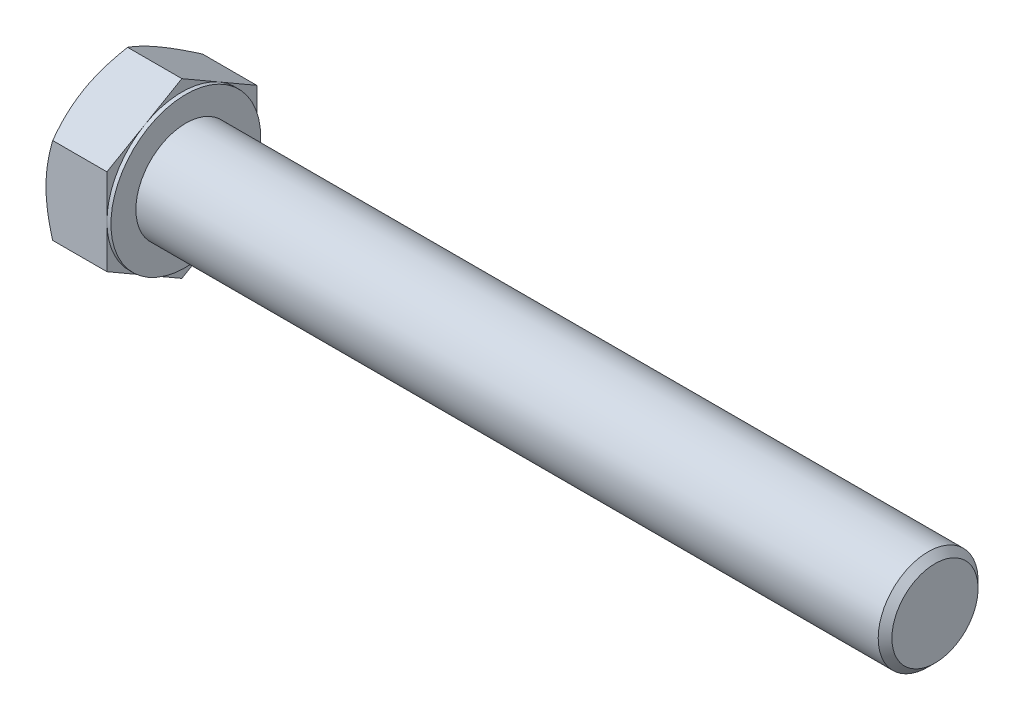
ISO-10303-21;
HEADER;
FILE_DESCRIPTION(('STEP AP214'),'2;1');
FILE_NAME('part.step','',(''),(''),'','','');
FILE_SCHEMA(('AUTOMOTIVE_DESIGN { 1 0 10303 214 1 1 1 1 }'));
ENDSEC;
DATA;
#1=APPLICATION_CONTEXT('core data for automotive mechanical design processes');
#2=APPLICATION_PROTOCOL_DEFINITION('international standard','automotive_design',2000,#1);
#3=PRODUCT_CONTEXT('',#1,'mechanical');
#4=PRODUCT('Part','Part','',(#3));
#5=PRODUCT_RELATED_PRODUCT_CATEGORY('part','',(#4));
#6=PRODUCT_DEFINITION_FORMATION('','',#4);
#7=PRODUCT_DEFINITION_CONTEXT('part definition',#1,'design');
#8=PRODUCT_DEFINITION('design','',#6,#7);
#9=PRODUCT_DEFINITION_SHAPE('','',#8);
#10=(LENGTH_UNIT() NAMED_UNIT(*) SI_UNIT(.MILLI.,.METRE.));
#11=(NAMED_UNIT(*) PLANE_ANGLE_UNIT() SI_UNIT($,.RADIAN.));
#12=(NAMED_UNIT(*) SI_UNIT($,.STERADIAN.) SOLID_ANGLE_UNIT());
#13=UNCERTAINTY_MEASURE_WITH_UNIT(LENGTH_MEASURE(1.E-05),#10,'distance_accuracy_value','');
#14=(GEOMETRIC_REPRESENTATION_CONTEXT(3) GLOBAL_UNCERTAINTY_ASSIGNED_CONTEXT((#13)) GLOBAL_UNIT_ASSIGNED_CONTEXT((#10,
#11,#12)) REPRESENTATION_CONTEXT('',''));
#15=CARTESIAN_POINT('',(0.,0.,0.));
#16=DIRECTION('',(0.,0.,1.));
#17=DIRECTION('',(1.,0.,0.));
#18=AXIS2_PLACEMENT_3D('',#15,#16,#17);
#19=CARTESIAN_POINT('',(13.,17.3205080756888,0.));
#20=DIRECTION('',(1.,0.,0.));
#21=DIRECTION('',(0.,0.,-1.));
#22=AXIS2_PLACEMENT_3D('',#19,#20,#21);
#23=PLANE('',#22);
#24=CARTESIAN_POINT('',(13.,0.,0.));
#25=DIRECTION('',(1.,0.,0.));
#26=DIRECTION('',(0.,0.,-1.));
#27=AXIS2_PLACEMENT_3D('',#24,#25,#26);
#28=CIRCLE('',#27,10.);
#29=CARTESIAN_POINT('',(13.,0.,-10.));
#30=VERTEX_POINT('',#29);
#31=EDGE_CURVE('E268',#30,#30,#28,.F.);
#32=ORIENTED_EDGE('',*,*,#31,.T.);
#33=EDGE_LOOP('',(#32));
#34=FACE_BOUND('',#33,.T.);
#35=CARTESIAN_POINT('',(13.,0.,0.));
#36=DIRECTION('',(1.,0.,0.));
#37=DIRECTION('',(0.,0.,-1.));
#38=AXIS2_PLACEMENT_3D('',#35,#36,#37);
#39=CIRCLE('',#38,15.);
#40=CARTESIAN_POINT('',(13.,0.,-15.));
#41=VERTEX_POINT('',#40);
#42=EDGE_CURVE('E326',#41,#41,#39,.T.);
#43=ORIENTED_EDGE('',*,*,#42,.T.);
#44=EDGE_LOOP('',(#43));
#45=FACE_BOUND('',#44,.T.);
#46=ADVANCED_FACE('F32',(#34,#45),#23,.T.);
#47=CARTESIAN_POINT('',(0.,0.,0.));
#48=DIRECTION('',(-1.,0.,0.));
#49=DIRECTION('',(0.,0.,1.));
#50=AXIS2_PLACEMENT_3D('',#47,#48,#49);
#51=CYLINDRICAL_SURFACE('',#50,10.);
#52=ORIENTED_EDGE('',*,*,#31,.F.);
#53=EDGE_LOOP('',(#52));
#54=FACE_BOUND('',#53,.T.);
#55=CARTESIAN_POINT('',(161.626,0.,0.));
#56=DIRECTION('',(-1.,0.,0.));
#57=DIRECTION('',(0.,0.,1.));
#58=AXIS2_PLACEMENT_3D('',#55,#56,#57);
#59=CIRCLE('',#58,10.);
#60=CARTESIAN_POINT('',(161.626,0.,10.));
#61=VERTEX_POINT('',#60);
#62=EDGE_CURVE('E266',#61,#61,#59,.T.);
#63=ORIENTED_EDGE('',*,*,#62,.T.);
#64=EDGE_LOOP('',(#63));
#65=FACE_BOUND('',#64,.T.);
#66=ADVANCED_FACE('F241',(#54,#65),#51,.T.);
#67=CARTESIAN_POINT('',(163.,0.,0.));
#68=DIRECTION('',(-1.,0.,0.));
#69=DIRECTION('',(0.,0.,1.));
#70=AXIS2_PLACEMENT_3D('',#67,#68,#69);
#71=CONICAL_SURFACE('',#70,8.626,0.785398163397452);
#72=ORIENTED_EDGE('',*,*,#62,.F.);
#73=EDGE_LOOP('',(#72));
#74=FACE_BOUND('',#73,.T.);
#75=CARTESIAN_POINT('',(163.,0.,0.));
#76=DIRECTION('',(-1.,0.,0.));
#77=DIRECTION('',(0.,0.,1.));
#78=AXIS2_PLACEMENT_3D('',#75,#76,#77);
#79=CIRCLE('',#78,8.626);
#80=CARTESIAN_POINT('',(163.,0.,8.626));
#81=VERTEX_POINT('',#80);
#82=EDGE_CURVE('E228',#81,#81,#79,.T.);
#83=ORIENTED_EDGE('',*,*,#82,.T.);
#84=EDGE_LOOP('',(#83));
#85=FACE_BOUND('',#84,.T.);
#86=ADVANCED_FACE('F246',(#74,#85),#71,.T.);
#87=CARTESIAN_POINT('',(163.,0.,0.));
#88=DIRECTION('',(-1.,0.,0.));
#89=DIRECTION('',(0.,0.,1.));
#90=AXIS2_PLACEMENT_3D('',#87,#88,#89);
#91=PLANE('',#90);
#92=ORIENTED_EDGE('',*,*,#82,.F.);
#93=EDGE_LOOP('',(#92));
#94=FACE_BOUND('',#93,.T.);
#95=ADVANCED_FACE('F253',(#94),#91,.F.);
#96=CARTESIAN_POINT('',(12.2,15.,0.));
#97=DIRECTION('',(1.,0.,0.));
#98=DIRECTION('',(0.,0.,-1.));
#99=AXIS2_PLACEMENT_3D('',#96,#97,#98);
#100=PLANE('',#99);
#101=DIRECTION('',(0.,0.500000000000001,0.866025403784438));
#102=VECTOR('',#101,1.);
#103=CARTESIAN_POINT('',(12.2,8.66025403784438,-15.));
#104=LINE('',#103,#102);
#105=CARTESIAN_POINT('',(12.2,8.66025403784441,-15.));
#106=VERTEX_POINT('',#105);
#107=CARTESIAN_POINT('',(12.2,12.9903810567666,-7.50000000000002));
#108=VERTEX_POINT('',#107);
#109=EDGE_CURVE('E165',#106,#108,#104,.T.);
#110=ORIENTED_EDGE('',*,*,#109,.T.);
#111=CARTESIAN_POINT('',(12.2,0.,0.));
#112=DIRECTION('',(-1.,0.,0.));
#113=DIRECTION('',(0.,0.,1.));
#114=AXIS2_PLACEMENT_3D('',#111,#112,#113);
#115=CIRCLE('',#114,15.);
#116=CARTESIAN_POINT('',(12.2,0.,-15.));
#117=VERTEX_POINT('',#116);
#118=EDGE_CURVE('E48',#108,#117,#115,.T.);
#119=ORIENTED_EDGE('',*,*,#118,.T.);
#120=DIRECTION('',(0.,1.,0.));
#121=VECTOR('',#120,1.);
#122=CARTESIAN_POINT('',(12.2,8.66025403784438,-15.));
#123=LINE('',#122,#121);
#124=EDGE_CURVE('E37',#117,#106,#123,.T.);
#125=ORIENTED_EDGE('',*,*,#124,.T.);
#126=EDGE_LOOP('',(#110,#119,#125));
#127=FACE_BOUND('',#126,.T.);
#128=ADVANCED_FACE('F256',(#127),#100,.T.);
#129=CARTESIAN_POINT('',(12.2,17.3205080756888,0.));
#130=VERTEX_POINT('',#129);
#131=EDGE_CURVE('E163',#108,#130,#104,.T.);
#132=ORIENTED_EDGE('',*,*,#131,.T.);
#133=DIRECTION('',(0.,-0.500000000000001,0.866025403784438));
#134=VECTOR('',#133,1.);
#135=CARTESIAN_POINT('',(12.2,17.3205080756888,0.));
#136=LINE('',#135,#134);
#137=CARTESIAN_POINT('',(12.2,12.9903810567666,7.50000000000002));
#138=VERTEX_POINT('',#137);
#139=EDGE_CURVE('E162',#130,#138,#136,.T.);
#140=ORIENTED_EDGE('',*,*,#139,.T.);
#141=EDGE_CURVE('E151',#138,#108,#115,.T.);
#142=ORIENTED_EDGE('',*,*,#141,.T.);
#143=EDGE_LOOP('',(#132,#140,#142));
#144=FACE_BOUND('',#143,.T.);
#145=ADVANCED_FACE('F261',(#144),#100,.T.);
#146=CARTESIAN_POINT('',(12.2,8.66025403784441,15.));
#147=VERTEX_POINT('',#146);
#148=EDGE_CURVE('E130',#138,#147,#136,.T.);
#149=ORIENTED_EDGE('',*,*,#148,.T.);
#150=DIRECTION('',(0.,-1.,0.));
#151=VECTOR('',#150,1.);
#152=CARTESIAN_POINT('',(12.2,8.66025403784437,15.));
#153=LINE('',#152,#151);
#154=CARTESIAN_POINT('',(12.2,0.,15.));
#155=VERTEX_POINT('',#154);
#156=EDGE_CURVE('E124',#147,#155,#153,.T.);
#157=ORIENTED_EDGE('',*,*,#156,.T.);
#158=EDGE_CURVE('E128',#155,#138,#115,.T.);
#159=ORIENTED_EDGE('',*,*,#158,.T.);
#160=EDGE_LOOP('',(#149,#157,#159));
#161=FACE_BOUND('',#160,.T.);
#162=ADVANCED_FACE('F126',(#161),#100,.T.);
#163=CARTESIAN_POINT('',(12.2,-8.6602540378444,15.));
#164=VERTEX_POINT('',#163);
#165=EDGE_CURVE('E134',#155,#164,#153,.T.);
#166=ORIENTED_EDGE('',*,*,#165,.T.);
#167=DIRECTION('',(0.,-0.500000000000001,-0.866025403784438));
#168=VECTOR('',#167,1.);
#169=CARTESIAN_POINT('',(12.2,-17.3205080756888,0.));
#170=LINE('',#169,#168);
#171=CARTESIAN_POINT('',(12.2,-12.9903810567666,7.50000000000002));
#172=VERTEX_POINT('',#171);
#173=EDGE_CURVE('E141',#164,#172,#170,.T.);
#174=ORIENTED_EDGE('',*,*,#173,.T.);
#175=EDGE_CURVE('E138',#172,#155,#115,.T.);
#176=ORIENTED_EDGE('',*,*,#175,.T.);
#177=EDGE_LOOP('',(#166,#174,#176));
#178=FACE_BOUND('',#177,.T.);
#179=ADVANCED_FACE('F139',(#178),#100,.T.);
#180=CARTESIAN_POINT('',(12.2,-17.3205080756888,0.));
#181=VERTEX_POINT('',#180);
#182=EDGE_CURVE('E157',#172,#181,#170,.T.);
#183=ORIENTED_EDGE('',*,*,#182,.T.);
#184=DIRECTION('',(0.,0.5,-0.866025403784438));
#185=VECTOR('',#184,1.);
#186=CARTESIAN_POINT('',(12.2,-8.66025403784441,-15.));
#187=LINE('',#186,#185);
#188=CARTESIAN_POINT('',(12.2,-12.9903810567666,-7.50000000000001));
#189=VERTEX_POINT('',#188);
#190=EDGE_CURVE('E339',#181,#189,#187,.T.);
#191=ORIENTED_EDGE('',*,*,#190,.T.);
#192=EDGE_CURVE('E145',#189,#172,#115,.T.);
#193=ORIENTED_EDGE('',*,*,#192,.T.);
#194=EDGE_LOOP('',(#183,#191,#193));
#195=FACE_BOUND('',#194,.T.);
#196=ADVANCED_FACE('F341',(#195),#100,.T.);
#197=CARTESIAN_POINT('',(12.2,-8.6602540378444,-15.));
#198=VERTEX_POINT('',#197);
#199=EDGE_CURVE('E152',#189,#198,#187,.T.);
#200=ORIENTED_EDGE('',*,*,#199,.T.);
#201=EDGE_CURVE('E11',#198,#117,#123,.T.);
#202=ORIENTED_EDGE('',*,*,#201,.T.);
#203=EDGE_CURVE('E338',#117,#189,#115,.T.);
#204=ORIENTED_EDGE('',*,*,#203,.T.);
#205=EDGE_LOOP('',(#200,#202,#204));
#206=FACE_BOUND('',#205,.T.);
#207=ADVANCED_FACE('F262',(#206),#100,.T.);
#208=CARTESIAN_POINT('',(0.,0.,0.));
#209=DIRECTION('',(-1.,0.,0.));
#210=DIRECTION('',(0.,0.,1.));
#211=AXIS2_PLACEMENT_3D('',#208,#209,#210);
#212=CYLINDRICAL_SURFACE('',#211,15.);
#213=ORIENTED_EDGE('',*,*,#118,.F.);
#214=ORIENTED_EDGE('',*,*,#141,.F.);
#215=ORIENTED_EDGE('',*,*,#158,.F.);
#216=ORIENTED_EDGE('',*,*,#175,.F.);
#217=ORIENTED_EDGE('',*,*,#192,.F.);
#218=ORIENTED_EDGE('',*,*,#203,.F.);
#219=EDGE_LOOP('',(#213,#214,#215,#216,#217,#218));
#220=FACE_BOUND('',#219,.T.);
#221=ORIENTED_EDGE('',*,*,#42,.F.);
#222=EDGE_LOOP('',(#221));
#223=FACE_BOUND('',#222,.T.);
#224=ADVANCED_FACE('F148',(#220,#223),#212,.T.);
#225=CARTESIAN_POINT('',(0.,17.3205080756888,0.));
#226=DIRECTION('',(1.,0.,0.));
#227=DIRECTION('',(0.,0.,-1.));
#228=AXIS2_PLACEMENT_3D('',#225,#226,#227);
#229=PLANE('',#228);
#230=CARTESIAN_POINT('',(0.,0.,0.));
#231=DIRECTION('',(1.,0.,0.));
#232=DIRECTION('',(0.,0.,-1.));
#233=AXIS2_PLACEMENT_3D('',#230,#231,#232);
#234=CIRCLE('',#233,15.);
#235=CARTESIAN_POINT('',(0.,0.,-15.));
#236=VERTEX_POINT('',#235);
#237=CARTESIAN_POINT('',(0.,12.9903810567666,-7.50000000000001));
#238=VERTEX_POINT('',#237);
#239=EDGE_CURVE('E325',#236,#238,#234,.T.);
#240=ORIENTED_EDGE('',*,*,#239,.F.);
#241=CARTESIAN_POINT('',(0.,-12.9903810567666,-7.50000000000002));
#242=VERTEX_POINT('',#241);
#243=EDGE_CURVE('E324',#242,#236,#234,.T.);
#244=ORIENTED_EDGE('',*,*,#243,.F.);
#245=CARTESIAN_POINT('',(0.,-12.9903810567666,7.50000000000003));
#246=VERTEX_POINT('',#245);
#247=EDGE_CURVE('E286',#246,#242,#234,.T.);
#248=ORIENTED_EDGE('',*,*,#247,.F.);
#249=CARTESIAN_POINT('',(0.,0.,15.));
#250=VERTEX_POINT('',#249);
#251=EDGE_CURVE('E296',#250,#246,#234,.T.);
#252=ORIENTED_EDGE('',*,*,#251,.F.);
#253=CARTESIAN_POINT('',(0.,12.9903810567666,7.50000000000002));
#254=VERTEX_POINT('',#253);
#255=EDGE_CURVE('E304',#254,#250,#234,.T.);
#256=ORIENTED_EDGE('',*,*,#255,.F.);
#257=EDGE_CURVE('E309',#238,#254,#234,.T.);
#258=ORIENTED_EDGE('',*,*,#257,.F.);
#259=EDGE_LOOP('',(#240,#244,#248,#252,#256,#258));
#260=FACE_BOUND('',#259,.T.);
#261=ADVANCED_FACE('F192',(#260),#229,.F.);
#262=CARTESIAN_POINT('',(-3.75000000000001,0.,0.));
#263=DIRECTION('',(1.,0.,0.));
#264=DIRECTION('',(0.,0.,-1.));
#265=AXIS2_PLACEMENT_3D('',#262,#263,#264);
#266=CONICAL_SURFACE('',#265,8.5048094716167,1.0471975511966);
#267=CARTESIAN_POINT('',(1.33981262948895,17.3206235457426,0.0002));
#268=CARTESIAN_POINT('',(1.22992178974395,17.130274565913,-0.329494104233799));
#269=CARTESIAN_POINT('',(1.12501758932862,16.939183122782,-0.6604741926283));
#270=CARTESIAN_POINT('',(0.926568581943114,16.5554679079492,-1.32508844035602));
#271=CARTESIAN_POINT('',(0.833027511049504,16.3628436543362,-1.6587234343838));
#272=CARTESIAN_POINT('',(0.65856214760987,15.9756905506624,-2.32929228025473));
#273=CARTESIAN_POINT('',(0.577667706602196,15.7811583127512,-2.66623200002701));
#274=CARTESIAN_POINT('',(0.430232643422051,15.3907420734253,-3.34245276263938));
#275=CARTESIAN_POINT('',(0.363691202381333,15.1948581497855,-3.68173367076952));
#276=CARTESIAN_POINT('',(0.247792374696314,14.8067578304067,-4.35394314236732));
#277=CARTESIAN_POINT('',(0.19805138343667,14.6145702475688,-4.68682180042634));
#278=CARTESIAN_POINT('',(0.11464674900361,14.2293144416655,-5.3541044301617));
#279=CARTESIAN_POINT('',(0.0809834152900895,14.0362462017216,-5.6885084310725));
#280=CARTESIAN_POINT('',(0.0305840757080862,13.6497853945792,-6.35787818417716));
#281=CARTESIAN_POINT('',(0.0138279549580509,13.4563934876199,-6.69284279280336));
#282=CARTESIAN_POINT('',(-0.00239660617302255,13.0694311550724,-7.36308121339101));
#283=CARTESIAN_POINT('',(-0.00186558072757971,12.8758607351851,-7.69835501547825));
#284=CARTESIAN_POINT('',(0.0152766129981678,12.5139822792559,-8.32514688731221));
#285=CARTESIAN_POINT('',(0.0297968460490141,12.3456484541475,-8.61670962503243));
#286=CARTESIAN_POINT('',(0.071637140422411,12.0093680110861,-9.19916443800649));
#287=CARTESIAN_POINT('',(0.0989581071094762,11.8414214213658,-9.49005646435989));
#288=CARTESIAN_POINT('',(0.165923511998905,11.5060066717823,-10.0710118522466));
#289=CARTESIAN_POINT('',(0.205578128270663,11.338539022767,-10.3610743289652));
#290=CARTESIAN_POINT('',(0.296515103017905,11.0043888432043,-10.939839417326));
#291=CARTESIAN_POINT('',(0.34779825196926,10.8377063668174,-11.2285419351595));
#292=CARTESIAN_POINT('',(0.52038686474711,10.3317324659531,-12.1049144387604));
#293=CARTESIAN_POINT('',(0.658901178256933,9.99390625559024,-12.6900465992373));
#294=CARTESIAN_POINT('',(0.973271968475216,9.32329122184509,-13.8515859100034));
#295=CARTESIAN_POINT('',(1.14905461461788,8.99049381241394,-14.4280079317654));
#296=CARTESIAN_POINT('',(1.33981262948894,8.66013856779054,-15.0002));
#297=B_SPLINE_CURVE_WITH_KNOTS('',3,(#267,#268,#269,#270,#271,#272,#273,#274,#275,#276,#277,
#278,#279,#280,#281,#282,#283,#284,#285,#286,#287,#288,#289,#290,#291,#292,#293,#294,#295,#296),
.UNSPECIFIED.,.F.,.F.,(4,2,2,2,2,2,2,2,2,2,2,2,2,2,4),(0.,1.18875411504163,2.37789802800057,
3.56980778300395,4.76164951910136,5.92407379683759,7.08652044780812,8.24758247406079,
9.40860862348377,10.4193068498566,11.4300765712312,12.4416826308653,13.4533574773408,
15.5211962051185,17.5849760846241),.UNSPECIFIED.);
#298=CARTESIAN_POINT('',(1.33974596215562,17.3205080756888,0.));
#299=VERTEX_POINT('',#298);
#300=EDGE_CURVE('E56',#299,#238,#297,.T.);
#301=ORIENTED_EDGE('',*,*,#300,.T.);
#302=ORIENTED_EDGE('',*,*,#257,.T.);
#303=CARTESIAN_POINT('',(1.33981262948894,8.66013856779053,15.0002));
#304=CARTESIAN_POINT('',(1.22992178974394,8.85048754762015,14.6705058957662));
#305=CARTESIAN_POINT('',(1.12501758932861,9.04157899075112,14.3395258073717));
#306=CARTESIAN_POINT('',(0.926568581943103,9.42529420558398,13.674911559644));
#307=CARTESIAN_POINT('',(0.833027511049493,9.617918459197,13.3412765656162));
#308=CARTESIAN_POINT('',(0.658562147609861,10.0050715628708,12.6707077197453));
#309=CARTESIAN_POINT('',(0.57766770660219,10.199603800782,12.333767999973));
#310=CARTESIAN_POINT('',(0.430232643422045,10.5900200401078,11.6575472373606));
#311=CARTESIAN_POINT('',(0.363691202381327,10.7859039637477,11.3182663292305));
#312=CARTESIAN_POINT('',(0.247792374696308,11.1740042831265,10.6460568576327));
#313=CARTESIAN_POINT('',(0.198051383436665,11.3661918659643,10.3131781995737));
#314=CARTESIAN_POINT('',(0.114646749003607,11.7514476718676,9.6458955698383));
#315=CARTESIAN_POINT('',(0.080983415290087,11.9445159118115,9.31149156892751));
#316=CARTESIAN_POINT('',(0.0305840757080849,12.3309767189539,8.64212181582285));
#317=CARTESIAN_POINT('',(0.0138279549580503,12.5243686259132,8.30715720719665));
#318=CARTESIAN_POINT('',(-0.0023966061730225,12.9113309584608,7.636918786609));
#319=CARTESIAN_POINT('',(-0.00186558072757983,13.1049013783481,7.30164498452176));
#320=CARTESIAN_POINT('',(0.0152766129981677,13.4667798342773,6.6748531126878));
#321=CARTESIAN_POINT('',(0.0297968460490142,13.6351136593857,6.38329037496757));
#322=CARTESIAN_POINT('',(0.0716371404224116,13.9713941024471,5.80083556199352));
#323=CARTESIAN_POINT('',(0.0989581071094771,14.1393406921673,5.50994353564011));
#324=CARTESIAN_POINT('',(0.165923511998907,14.4747554417509,4.92898814775338));
#325=CARTESIAN_POINT('',(0.205578128270665,14.6422230907662,4.63892567103482));
#326=CARTESIAN_POINT('',(0.296515103017909,14.9763732703289,4.06016058267396));
#327=CARTESIAN_POINT('',(0.347798251969264,15.1430557467157,3.77145806484047));
#328=CARTESIAN_POINT('',(0.520386864747114,15.6490296475801,2.89508556123959));
#329=CARTESIAN_POINT('',(0.658901178256938,15.9868558579429,2.30995340076275));
#330=CARTESIAN_POINT('',(0.973271968475223,16.6574708916881,1.14841408999664));
#331=CARTESIAN_POINT('',(1.14905461461789,16.9902683011192,0.571992068234584));
#332=CARTESIAN_POINT('',(1.33981262948895,17.3206235457426,-0.000200000000001569));
#333=B_SPLINE_CURVE_WITH_KNOTS('',3,(#303,#304,#305,#306,#307,#308,#309,#310,#311,#312,#313,
#314,#315,#316,#317,#318,#319,#320,#321,#322,#323,#324,#325,#326,#327,#328,#329,#330,#331,#332),
.UNSPECIFIED.,.F.,.F.,(4,2,2,2,2,2,2,2,2,2,2,2,2,2,4),(0.,1.18875411504163,2.37789802800057,
3.56980778300395,4.76164951910136,5.92407379683759,7.08652044780812,8.24758247406078,
9.40860862348377,10.4193068498566,11.4300765712312,12.4416826308653,13.4533574773408,
15.5211962051185,17.5849760846241),.UNSPECIFIED.);
#334=EDGE_CURVE('E227',#254,#299,#333,.T.);
#335=ORIENTED_EDGE('',*,*,#334,.T.);
#336=EDGE_LOOP('',(#301,#302,#335));
#337=FACE_BOUND('',#336,.T.);
#338=ADVANCED_FACE('F181',(#337),#266,.T.);
#339=CARTESIAN_POINT('',(1.33974596215561,8.66025403784437,15.));
#340=VERTEX_POINT('',#339);
#341=EDGE_CURVE('E222',#340,#254,#333,.T.);
#342=ORIENTED_EDGE('',*,*,#341,.T.);
#343=ORIENTED_EDGE('',*,*,#255,.T.);
#344=CARTESIAN_POINT('',(7.34067071515341,-23.3042652502346,15.));
#345=CARTESIAN_POINT('',(7.18156779867751,-22.9765341561843,15.));
#346=CARTESIAN_POINT('',(7.02325509780218,-22.648419619423,15.));
#347=CARTESIAN_POINT('',(6.70838900944477,-21.9913436592706,15.));
#348=CARTESIAN_POINT('',(6.55183563953033,-21.6623822274633,15.));
#349=CARTESIAN_POINT('',(6.08504186446723,-20.6740205756075,15.));
#350=CARTESIAN_POINT('',(5.77771466676501,-20.013239287009,15.));
#351=CARTESIAN_POINT('',(5.1710334736663,-18.6836927165475,15.));
#352=CARTESIAN_POINT('',(4.87173163285706,-18.0149035792745,15.));
#353=CARTESIAN_POINT('',(4.28531537205743,-16.672021466831,15.));
#354=CARTESIAN_POINT('',(3.99820037915414,-15.9979287427559,15.));
#355=CARTESIAN_POINT('',(3.43032614621723,-14.6214178954332,15.));
#356=CARTESIAN_POINT('',(3.15007396164639,-13.9187894970855,15.));
#357=CARTESIAN_POINT('',(2.61067811288133,-12.5053227943984,15.));
#358=CARTESIAN_POINT('',(2.35153681205784,-11.7944835809986,15.));
#359=CARTESIAN_POINT('',(1.86113921287668,-10.3648046207861,15.));
#360=CARTESIAN_POINT('',(1.62982681897162,-9.64598427064374,15.));
#361=CARTESIAN_POINT('',(1.20246884447069,-8.19796416946781,15.));
#362=CARTESIAN_POINT('',(1.00641219949375,-7.4687677525739,15.));
#363=CARTESIAN_POINT('',(0.746381489548805,-6.36908708426342,15.));
#364=CARTESIAN_POINT('',(0.665556542332847,-6.00256349464106,15.));
#365=CARTESIAN_POINT('',(0.516215906279777,-5.26700410132772,15.));
#366=CARTESIAN_POINT('',(0.447699966240371,-4.89796834906453,15.));
#367=CARTESIAN_POINT('',(0.324184020148005,-4.1576349881433,15.));
#368=CARTESIAN_POINT('',(0.269183850795452,-3.78633740686858,15.));
#369=CARTESIAN_POINT('',(0.173795520486809,-3.04187310827177,15.));
#370=CARTESIAN_POINT('',(0.133406727499752,-2.66870647250577,15.));
#371=CARTESIAN_POINT('',(0.0685517789539601,-1.92591313748794,15.));
#372=CARTESIAN_POINT('',(0.0438838189783439,-1.55630416674746,15.));
#373=CARTESIAN_POINT('',(0.010202640260208,-0.816374859116392,15.));
#374=CARTESIAN_POINT('',(0.00118916075528576,-0.446054534177949,15.));
#375=CARTESIAN_POINT('',(-0.000968542023530779,0.294636183080746,15.));
#376=CARTESIAN_POINT('',(0.00588729773335592,0.665006575594019,15.));
#377=CARTESIAN_POINT('',(0.0353005369749854,1.40512739642794,15.));
#378=CARTESIAN_POINT('',(0.0578586405592725,1.7748777962024,15.));
#379=CARTESIAN_POINT('',(0.130359529520864,2.66225131615495,15.));
#380=CARTESIAN_POINT('',(0.187682894452926,3.17928211157757,15.));
#381=CARTESIAN_POINT('',(0.329920354848765,4.20953694220726,15.));
#382=CARTESIAN_POINT('',(0.414838167720419,4.72276045497981,15.));
#383=CARTESIAN_POINT('',(0.609243756551085,5.74490151650211,15.));
#384=CARTESIAN_POINT('',(0.718750596562519,6.25381540456157,15.));
#385=CARTESIAN_POINT('',(0.958990010594623,7.26655289822442,15.));
#386=CARTESIAN_POINT('',(1.08972227136761,7.77037657883325,15.));
#387=CARTESIAN_POINT('',(1.37231868690396,8.78401362845183,15.));
#388=CARTESIAN_POINT('',(1.52458533942789,9.29371400216389,15.));
#389=CARTESIAN_POINT('',(1.84492743287877,10.3080942836652,15.));
#390=CARTESIAN_POINT('',(2.01300297781563,10.8127741583994,15.));
#391=CARTESIAN_POINT('',(2.36228753701366,11.8173612741182,15.));
#392=CARTESIAN_POINT('',(2.54349222713181,12.3172700256552,15.));
#393=CARTESIAN_POINT('',(2.91689581252832,13.3129403414727,15.));
#394=CARTESIAN_POINT('',(3.10909458126464,13.8087019534116,15.));
#395=CARTESIAN_POINT('',(3.57360485355451,14.9746038035994,15.));
#396=CARTESIAN_POINT('',(3.84982124497854,15.6431858961614,15.));
#397=CARTESIAN_POINT('',(4.41563784259355,16.9746795615836,15.));
#398=CARTESIAN_POINT('',(4.70523886905364,17.6375907839498,15.));
#399=CARTESIAN_POINT('',(5.29515643160973,18.9587926969959,15.));
#400=CARTESIAN_POINT('',(5.59547534200812,19.6170823247284,15.));
#401=CARTESIAN_POINT('',(6.20467573064066,20.929660672768,15.));
#402=CARTESIAN_POINT('',(6.51355702718966,21.5839494776095,15.));
#403=CARTESIAN_POINT('',(7.13862847265524,22.8898994902308,15.));
#404=CARTESIAN_POINT('',(7.45482623896846,23.5415570457316,15.));
#405=CARTESIAN_POINT('',(8.09295875416606,24.8420565829958,15.));
#406=CARTESIAN_POINT('',(8.4148935275708,25.4908985527104,15.));
#407=CARTESIAN_POINT('',(9.06347819779508,26.7861146196969,15.));
#408=CARTESIAN_POINT('',(9.39012748233845,27.4324890238882,15.));
#409=CARTESIAN_POINT('',(10.0474129227362,28.723208677604,15.));
#410=CARTESIAN_POINT('',(10.3780490943186,29.367553919111,15.));
#411=CARTESIAN_POINT('',(11.3194716957165,31.1905009177914,15.));
#412=CARTESIAN_POINT('',(11.9342118225534,32.3670608397852,15.));
#413=CARTESIAN_POINT('',(13.1721121262381,34.7157851558138,15.));
#414=CARTESIAN_POINT('',(13.7952725995008,35.8879493932455,15.));
#415=CARTESIAN_POINT('',(15.0464839728173,38.2259091871195,15.));
#416=CARTESIAN_POINT('',(15.6745188321177,39.3917133340376,15.));
#417=CARTESIAN_POINT('',(16.6203232909783,41.1383439953253,15.));
#418=CARTESIAN_POINT('',(16.9362082187349,41.7201925939891,15.));
#419=CARTESIAN_POINT('',(17.5691038731806,42.8832760591036,15.));
#420=CARTESIAN_POINT('',(17.886114598108,43.4645109265129,15.));
#421=CARTESIAN_POINT('',(18.2036234821095,44.045473617856,15.));
#422=B_SPLINE_CURVE_WITH_KNOTS('',3,(#344,#345,#346,#347,#348,#349,#350,#351,#352,#353,#354,
#355,#356,#357,#358,#359,#360,#361,#362,#363,#364,#365,#366,#367,#368,#369,#370,#371,#372,#373,
#374,#375,#376,#377,#378,#379,#380,#381,#382,#383,#384,#385,#386,#387,#388,#389,#390,#391,#392,
#393,#394,#395,#396,#397,#398,#399,#400,#401,#402,#403,#404,#405,#406,#407,#408,#409,#410,#411,
#412,#413,#414,#415,#416,#417,#418,#419,#420,#421),.UNSPECIFIED.,.F.,.F.,(4,2,2,2,2,2,2,2,2,2,2,
2,2,2,2,2,2,2,2,2,2,2,2,2,2,2,2,2,2,2,2,2,2,2,2,2,2,2,4),(0.,1.0929265174083,2.18586393846465,
4.37206003457367,6.57008822665549,8.76801297307203,11.037126459905,13.3064936266831,
15.5712068703933,17.8352081295547,18.9610232976558,20.0868154875035,21.2125940746902,
22.3383239592763,23.4492954988051,24.5602485322974,25.6712059783518,26.7822132436575,
28.3419475576269,29.9018920796078,31.4630502397376,33.024185362174,34.6197538618724,
36.2153328598743,37.8103887148469,39.4054262143923,41.5754079616112,43.7455228716224,
45.9161215420534,48.0866741897833,50.259598540134,52.4325321799329,54.6051861145462,
56.7778486229257,60.7602319673314,64.7427558676026,68.715363316539,70.7015596979606,
72.6877529724689),.UNSPECIFIED.);
#423=EDGE_CURVE('E221',#250,#340,#422,.T.);
#424=ORIENTED_EDGE('',*,*,#423,.T.);
#425=EDGE_LOOP('',(#342,#343,#424));
#426=FACE_BOUND('',#425,.T.);
#427=ADVANCED_FACE('F302',(#426),#266,.T.);
#428=CARTESIAN_POINT('',(1.33974596215562,-8.6602540378444,15.));
#429=VERTEX_POINT('',#428);
#430=EDGE_CURVE('E216',#429,#250,#422,.T.);
#431=ORIENTED_EDGE('',*,*,#430,.T.);
#432=ORIENTED_EDGE('',*,*,#251,.T.);
#433=CARTESIAN_POINT('',(1.33981262948897,-17.3206235457426,-0.000200000000000181));
#434=CARTESIAN_POINT('',(1.22992178974396,-17.130274565913,0.329494104233799));
#435=CARTESIAN_POINT('',(1.12501758932864,-16.9391831227821,0.6604741926283));
#436=CARTESIAN_POINT('',(0.926568581943126,-16.5554679079492,1.32508844035602));
#437=CARTESIAN_POINT('',(0.833027511049516,-16.3628436543362,1.6587234343838));
#438=CARTESIAN_POINT('',(0.658562147609881,-15.9756905506624,2.32929228025473));
#439=CARTESIAN_POINT('',(0.577667706602208,-15.7811583127512,2.66623200002701));
#440=CARTESIAN_POINT('',(0.430232643422063,-15.3907420734253,3.34245276263939));
#441=CARTESIAN_POINT('',(0.363691202381345,-15.1948581497855,3.68173367076952));
#442=CARTESIAN_POINT('',(0.247792374696326,-14.8067578304067,4.35394314236732));
#443=CARTESIAN_POINT('',(0.198051383436683,-14.6145702475688,4.68682180042635));
#444=CARTESIAN_POINT('',(0.114646749003623,-14.2293144416656,5.3541044301617));
#445=CARTESIAN_POINT('',(0.0809834152901017,-14.0362462017216,5.6885084310725));
#446=CARTESIAN_POINT('',(0.0305840757080979,-13.6497853945793,6.35787818417716));
#447=CARTESIAN_POINT('',(0.0138279549580624,-13.4563934876199,6.69284279280336));
#448=CARTESIAN_POINT('',(-0.00239660617301051,-13.0694311550724,7.36308121339102));
#449=CARTESIAN_POINT('',(-0.00186558072756715,-12.8758607351851,7.69835501547826));
#450=CARTESIAN_POINT('',(0.0152766129981798,-12.5139822792559,8.32514688731222));
#451=CARTESIAN_POINT('',(0.029796846049025,-12.3456484541475,8.61670962503244));
#452=CARTESIAN_POINT('',(0.0716371404224209,-12.0093680110861,9.19916443800649));
#453=CARTESIAN_POINT('',(0.098958107109486,-11.8414214213659,9.4900564643599));
#454=CARTESIAN_POINT('',(0.165923511998914,-11.5060066717823,10.0710118522466));
#455=CARTESIAN_POINT('',(0.205578128270672,-11.338539022767,10.3610743289652));
#456=CARTESIAN_POINT('',(0.296515103017914,-11.0043888432043,10.939839417326));
#457=CARTESIAN_POINT('',(0.347798251969268,-10.8377063668174,11.2285419351595));
#458=CARTESIAN_POINT('',(0.520386864747118,-10.3317324659531,12.1049144387604));
#459=CARTESIAN_POINT('',(0.658901178256941,-9.99390625559026,12.6900465992373));
#460=CARTESIAN_POINT('',(0.973271968475223,-9.32329122184512,13.8515859100034));
#461=CARTESIAN_POINT('',(1.14905461461789,-8.99049381241397,14.4280079317654));
#462=CARTESIAN_POINT('',(1.33981262948895,-8.66013856779056,15.0002));
#463=B_SPLINE_CURVE_WITH_KNOTS('',3,(#433,#434,#435,#436,#437,#438,#439,#440,#441,#442,#443,
#444,#445,#446,#447,#448,#449,#450,#451,#452,#453,#454,#455,#456,#457,#458,#459,#460,#461,#462),
.UNSPECIFIED.,.F.,.F.,(4,2,2,2,2,2,2,2,2,2,2,2,2,2,4),(0.,1.18875411504163,2.37789802800057,
3.56980778300395,4.76164951910137,5.9240737968376,7.08652044780813,8.2475824740608,
9.40860862348379,10.4193068498566,11.4300765712312,12.4416826308653,13.4533574773408,
15.5211962051185,17.5849760846241),.UNSPECIFIED.);
#464=EDGE_CURVE('E210',#246,#429,#463,.T.);
#465=ORIENTED_EDGE('',*,*,#464,.T.);
#466=EDGE_LOOP('',(#431,#432,#465));
#467=FACE_BOUND('',#466,.T.);
#468=ADVANCED_FACE('F293',(#467),#266,.T.);
#469=CARTESIAN_POINT('',(1.33974596215564,-17.3205080756888,0.));
#470=VERTEX_POINT('',#469);
#471=EDGE_CURVE('E205',#470,#246,#463,.T.);
#472=ORIENTED_EDGE('',*,*,#471,.T.);
#473=ORIENTED_EDGE('',*,*,#247,.T.);
#474=CARTESIAN_POINT('',(1.33981262948895,-8.66013856779057,-15.0002));
#475=CARTESIAN_POINT('',(1.22992178974395,-8.85048754762019,-14.6705058957662));
#476=CARTESIAN_POINT('',(1.12501758932862,-9.04157899075116,-14.3395258073717));
#477=CARTESIAN_POINT('',(0.926568581943119,-9.42529420558402,-13.674911559644));
#478=CARTESIAN_POINT('',(0.833027511049509,-9.61791845919704,-13.3412765656162));
#479=CARTESIAN_POINT('',(0.658562147609876,-10.0050715628708,-12.6707077197453));
#480=CARTESIAN_POINT('',(0.577667706602203,-10.199603800782,-12.333767999973));
#481=CARTESIAN_POINT('',(0.430232643422058,-10.5900200401079,-11.6575472373606));
#482=CARTESIAN_POINT('',(0.36369120238134,-10.7859039637477,-11.3182663292305));
#483=CARTESIAN_POINT('',(0.247792374696322,-11.1740042831265,-10.6460568576327));
#484=CARTESIAN_POINT('',(0.198051383436679,-11.3661918659644,-10.3131781995737));
#485=CARTESIAN_POINT('',(0.114646749003621,-11.7514476718676,-9.6458955698383));
#486=CARTESIAN_POINT('',(0.0809834152901004,-11.9445159118116,-9.3114915689275));
#487=CARTESIAN_POINT('',(0.0305840757080987,-12.3309767189539,-8.64212181582284));
#488=CARTESIAN_POINT('',(0.0138279549580645,-12.5243686259133,-8.30715720719664));
#489=CARTESIAN_POINT('',(-0.00239660617300744,-12.9113309584608,-7.63691878660899));
#490=CARTESIAN_POINT('',(-0.00186558072756425,-13.1049013783481,-7.30164498452175));
#491=CARTESIAN_POINT('',(0.0152766129981837,-13.4667798342773,-6.67485311268779));
#492=CARTESIAN_POINT('',(0.0297968460490301,-13.6351136593857,-6.38329037496757));
#493=CARTESIAN_POINT('',(0.0716371404224275,-13.9713941024471,-5.80083556199351));
#494=CARTESIAN_POINT('',(0.0989581071094931,-14.1393406921673,-5.50994353564011));
#495=CARTESIAN_POINT('',(0.165923511998923,-14.4747554417509,-4.92898814775337));
#496=CARTESIAN_POINT('',(0.205578128270681,-14.6422230907662,-4.63892567103481));
#497=CARTESIAN_POINT('',(0.296515103017924,-14.9763732703289,-4.06016058267396));
#498=CARTESIAN_POINT('',(0.347798251969279,-15.1430557467158,-3.77145806484047));
#499=CARTESIAN_POINT('',(0.520386864747129,-15.6490296475801,-2.89508556123959));
#500=CARTESIAN_POINT('',(0.658901178256953,-15.9868558579429,-2.30995340076274));
#501=CARTESIAN_POINT('',(0.973271968475238,-16.6574708916881,-1.14841408999664));
#502=CARTESIAN_POINT('',(1.1490546146179,-16.9902683011192,-0.571992068234585));
#503=CARTESIAN_POINT('',(1.33981262948897,-17.3206235457426,0.000200000000001542));
#504=B_SPLINE_CURVE_WITH_KNOTS('',3,(#474,#475,#476,#477,#478,#479,#480,#481,#482,#483,#484,
#485,#486,#487,#488,#489,#490,#491,#492,#493,#494,#495,#496,#497,#498,#499,#500,#501,#502,#503),
.UNSPECIFIED.,.F.,.F.,(4,2,2,2,2,2,2,2,2,2,2,2,2,2,4),(0.,1.18875411504163,2.37789802800057,
3.56980778300395,4.76164951910136,5.92407379683759,7.08652044780812,8.24758247406079,
9.40860862348378,10.4193068498566,11.4300765712312,12.4416826308653,13.4533574773408,
15.5211962051185,17.5849760846241),.UNSPECIFIED.);
#505=EDGE_CURVE('E211',#242,#470,#504,.T.);
#506=ORIENTED_EDGE('',*,*,#505,.T.);
#507=EDGE_LOOP('',(#472,#473,#506));
#508=FACE_BOUND('',#507,.T.);
#509=ADVANCED_FACE('F283',(#508),#266,.T.);
#510=CARTESIAN_POINT('',(7.34067071555574,-23.3042652510633,-15.));
#511=CARTESIAN_POINT('',(7.18156779907142,-22.9765341569991,-15.));
#512=CARTESIAN_POINT('',(7.02325509818769,-22.6484196202238,-15.));
#513=CARTESIAN_POINT('',(6.70838900981346,-21.9913436600436,-15.));
#514=CARTESIAN_POINT('',(6.55183563989063,-21.6623822282224,-15.));
#515=CARTESIAN_POINT('',(6.08504186480237,-20.6740205763247,-15.));
#516=CARTESIAN_POINT('',(5.77771466708342,-20.0132392876983,-15.));
#517=CARTESIAN_POINT('',(5.17103347395122,-18.6836927171804,-15.));
#518=CARTESIAN_POINT('',(4.87173163312524,-18.0149035798791,-15.));
#519=CARTESIAN_POINT('',(4.28531537229239,-16.6720214673786,-15.));
#520=CARTESIAN_POINT('',(3.99820037937263,-15.997928743275,-15.));
#521=CARTESIAN_POINT('',(3.43032614640236,-14.6214178958929,-15.));
#522=CARTESIAN_POINT('',(3.15007396181466,-13.9187894975144,-15.));
#523=CARTESIAN_POINT('',(2.61067811301679,-12.5053227947654,-15.));
#524=CARTESIAN_POINT('',(2.35153681217735,-11.7944835813343,-15.));
#525=CARTESIAN_POINT('',(1.86113921296584,-10.3648046210588,-15.));
#526=CARTESIAN_POINT('',(1.62982681904638,-9.64598427088453,-15.));
#527=CARTESIAN_POINT('',(1.20246884451903,-8.19796416964406,-15.));
#528=CARTESIAN_POINT('',(1.00641219953006,-7.46876775271744,-15.));
#529=CARTESIAN_POINT('',(0.746381489567905,-6.36908708434916,-15.));
#530=CARTESIAN_POINT('',(0.665556542345646,-6.00256349470202,-15.));
#531=CARTESIAN_POINT('',(0.516215906281607,-5.26700410133877,-15.));
#532=CARTESIAN_POINT('',(0.447699966237534,-4.89796834905046,-15.));
#533=CARTESIAN_POINT('',(0.324184020137722,-4.15763498807871,-15.));
#534=CARTESIAN_POINT('',(0.269183850782389,-3.78633740677858,-15.));
#535=CARTESIAN_POINT('',(0.173795520470279,-3.04187310813078,-15.));
#536=CARTESIAN_POINT('',(0.133406727482536,-2.66870647233917,-15.));
#537=CARTESIAN_POINT('',(0.0685517789376289,-1.92591313727066,-15.));
#538=CARTESIAN_POINT('',(0.043883818963543,-1.55630416650511,-15.));
#539=CARTESIAN_POINT('',(0.0102026402506712,-0.816374858823962,-15.));
#540=CARTESIAN_POINT('',(0.00118916074948269,-0.446054533860508,-15.));
#541=CARTESIAN_POINT('',(-0.000968542019720306,0.29463618344802,-15.));
#542=CARTESIAN_POINT('',(0.0058872977430468,0.665006575986113,-15.));
#543=CARTESIAN_POINT('',(0.0353005369984237,1.40512739686934,-15.));
#544=CARTESIAN_POINT('',(0.0578586405905778,1.77487779666829,-15.));
#545=CARTESIAN_POINT('',(0.130359529571533,2.66225131665907,-15.));
#546=CARTESIAN_POINT('',(0.187682894514773,3.17928211209532,-15.));
#547=CARTESIAN_POINT('',(0.32992035493357,4.20953694275166,-15.));
#548=CARTESIAN_POINT('',(0.414838167817002,4.72276045553724,-15.));
#549=CARTESIAN_POINT('',(0.609243756671416,5.74490151708511,-15.));
#550=CARTESIAN_POINT('',(0.718750596694819,6.25381540515712,-15.));
#551=CARTESIAN_POINT('',(0.958990010750752,7.26655289884473,-15.));
#552=CARTESIAN_POINT('',(1.0897222715356,7.77037657946576,-15.));
#553=CARTESIAN_POINT('',(1.37231868709573,8.78401362910906,-15.));
#554=CARTESIAN_POINT('',(1.52458533963158,9.29371400283363,-15.));
#555=CARTESIAN_POINT('',(1.84492743310594,10.3080942843598,-15.));
#556=CARTESIAN_POINT('',(2.01300297805437,10.8127741591064,-15.));
#557=CARTESIAN_POINT('',(2.36228753727513,11.8173612748499,-15.));
#558=CARTESIAN_POINT('',(2.54349222740445,12.3172700263992,-15.));
#559=CARTESIAN_POINT('',(2.91689581282292,13.3129403422413,-15.));
#560=CARTESIAN_POINT('',(3.10909458157004,13.8087019541924,-15.));
#561=CARTESIAN_POINT('',(3.57360485387678,14.9746038043887,-15.));
#562=CARTESIAN_POINT('',(3.84982124530625,15.6431858969472,-15.));
#563=CARTESIAN_POINT('',(4.41563784293084,16.9746795623627,-15.));
#564=CARTESIAN_POINT('',(4.70523886939508,17.6375907847257,-15.));
#565=CARTESIAN_POINT('',(5.2951564319585,18.9587926977659,-15.));
#566=CARTESIAN_POINT('',(5.59547534236007,19.6170823254955,-15.));
#567=CARTESIAN_POINT('',(6.20467573099824,20.9296606735296,-15.));
#568=CARTESIAN_POINT('',(6.51355702754968,21.5839494783686,-15.));
#569=CARTESIAN_POINT('',(7.13862847301955,22.889899490985,-15.));
#570=CARTESIAN_POINT('',(7.45482623933458,23.5415570464833,-15.));
#571=CARTESIAN_POINT('',(8.0929587545354,24.8420565837429,-15.));
#572=CARTESIAN_POINT('',(8.41489352794152,25.4908985534553,-15.));
#573=CARTESIAN_POINT('',(9.06347819816822,26.7861146204375,-15.));
#574=CARTESIAN_POINT('',(9.39012748271263,27.4324890246267,-15.));
#575=CARTESIAN_POINT('',(10.0474129231122,28.7232086783385,-15.));
#576=CARTESIAN_POINT('',(10.3780490946954,29.3675539198437,-15.));
#577=CARTESIAN_POINT('',(11.3194716960964,31.1905009185215,-15.));
#578=CARTESIAN_POINT('',(11.9342118229356,32.3670608405146,-15.));
#579=CARTESIAN_POINT('',(13.1721121266242,34.7157851565422,-15.));
#580=CARTESIAN_POINT('',(13.7952725998887,35.8879493939735,-15.));
#581=CARTESIAN_POINT('',(15.0464839732086,38.2259091878475,-15.));
#582=CARTESIAN_POINT('',(15.6745188325107,39.3917133347658,-15.));
#583=CARTESIAN_POINT('',(16.6203232913735,41.138343996054,-15.));
#584=CARTESIAN_POINT('',(16.9362082191309,41.720192594718,-15.));
#585=CARTESIAN_POINT('',(17.5691038735781,42.8832760598329,-15.));
#586=CARTESIAN_POINT('',(17.8861145985061,43.4645109272424,-15.));
#587=CARTESIAN_POINT('',(18.2036234825084,44.0454736185858,-15.));
#588=B_SPLINE_CURVE_WITH_KNOTS('',3,(#510,#511,#512,#513,#514,#515,#516,#517,#518,#519,#520,
#521,#522,#523,#524,#525,#526,#527,#528,#529,#530,#531,#532,#533,#534,#535,#536,#537,#538,#539,
#540,#541,#542,#543,#544,#545,#546,#547,#548,#549,#550,#551,#552,#553,#554,#555,#556,#557,#558,
#559,#560,#561,#562,#563,#564,#565,#566,#567,#568,#569,#570,#571,#572,#573,#574,#575,#576,#577,
#578,#579,#580,#581,#582,#583,#584,#585,#586,#587),.UNSPECIFIED.,.F.,.F.,(4,2,2,2,2,2,2,2,2,2,2,
2,2,2,2,2,2,2,2,2,2,2,2,2,2,2,2,2,2,2,2,2,2,2,2,2,2,2,4),(0.,1.09292651745689,2.18586393856183,
4.37206003476804,6.57008822694811,8.7680129734629,11.0371264604002,13.3064936272828,
15.5712068710971,17.8352081303625,18.9610232985403,20.0868154884646,21.2125940757278,
22.3383239603904,23.4492954999938,24.5602485335608,25.67120597969,26.7822132450703,
28.3419475590841,29.9018920811093,31.4630502412834,33.0241853637642,34.6197538635089,
36.215332861557,37.8103887165756,39.4054262161672,41.5754079633825,43.74552287339,
45.9161215438172,48.0866741915433,50.2595985418898,52.4325321816846,54.6051861162939,
56.7778486246693,60.7602319690765,64.7427558693492,68.7153633182886,70.7015596997118,
72.6877529742217),.UNSPECIFIED.);
#589=CARTESIAN_POINT('',(1.33974596215561,8.66025403784438,-15.));
#590=VERTEX_POINT('',#589);
#591=EDGE_CURVE('E175',#590,#236,#588,.F.);
#592=ORIENTED_EDGE('',*,*,#591,.T.);
#593=ORIENTED_EDGE('',*,*,#239,.T.);
#594=EDGE_CURVE('E212',#238,#590,#297,.T.);
#595=ORIENTED_EDGE('',*,*,#594,.T.);
#596=EDGE_LOOP('',(#592,#593,#595));
#597=FACE_BOUND('',#596,.T.);
#598=ADVANCED_FACE('F329',(#597),#266,.T.);
#599=CARTESIAN_POINT('',(1.33974596215562,-8.66025403784441,-15.));
#600=VERTEX_POINT('',#599);
#601=EDGE_CURVE('E174',#600,#242,#504,.T.);
#602=ORIENTED_EDGE('',*,*,#601,.T.);
#603=ORIENTED_EDGE('',*,*,#243,.T.);
#604=EDGE_CURVE('E166',#236,#600,#588,.F.);
#605=ORIENTED_EDGE('',*,*,#604,.T.);
#606=EDGE_LOOP('',(#602,#603,#605));
#607=FACE_BOUND('',#606,.T.);
#608=ADVANCED_FACE('F190',(#607),#266,.T.);
#609=CARTESIAN_POINT('',(13.,8.66025403784438,-15.));
#610=DIRECTION('',(0.,0.,1.));
#611=DIRECTION('',(0.,-1.,0.));
#612=AXIS2_PLACEMENT_3D('',#609,#610,#611);
#613=PLANE('',#612);
#614=ORIENTED_EDGE('',*,*,#201,.F.);
#615=DIRECTION('',(-1.,0.,0.));
#616=VECTOR('',#615,1.);
#617=CARTESIAN_POINT('',(13.,-8.66025403784441,-15.));
#618=LINE('',#617,#616);
#619=EDGE_CURVE('E315',#198,#600,#618,.T.);
#620=ORIENTED_EDGE('',*,*,#619,.T.);
#621=ORIENTED_EDGE('',*,*,#604,.F.);
#622=ORIENTED_EDGE('',*,*,#591,.F.);
#623=DIRECTION('',(-1.,0.,0.));
#624=VECTOR('',#623,1.);
#625=CARTESIAN_POINT('',(13.,8.66025403784438,-15.));
#626=LINE('',#625,#624);
#627=EDGE_CURVE('E313',#106,#590,#626,.T.);
#628=ORIENTED_EDGE('',*,*,#627,.F.);
#629=ORIENTED_EDGE('',*,*,#124,.F.);
#630=EDGE_LOOP('',(#614,#620,#621,#622,#628,#629));
#631=FACE_BOUND('',#630,.T.);
#632=ADVANCED_FACE('F185',(#631),#613,.F.);
#633=CARTESIAN_POINT('',(13.,-8.66025403784441,-15.));
#634=DIRECTION('',(0.,0.866025403784438,0.5));
#635=DIRECTION('',(0.,-0.5,0.866025403784438));
#636=AXIS2_PLACEMENT_3D('',#633,#634,#635);
#637=PLANE('',#636);
#638=ORIENTED_EDGE('',*,*,#190,.F.);
#639=DIRECTION('',(-1.,0.,0.));
#640=VECTOR('',#639,1.);
#641=CARTESIAN_POINT('',(13.,-17.3205080756888,0.));
#642=LINE('',#641,#640);
#643=EDGE_CURVE('E290',#181,#470,#642,.T.);
#644=ORIENTED_EDGE('',*,*,#643,.T.);
#645=ORIENTED_EDGE('',*,*,#505,.F.);
#646=ORIENTED_EDGE('',*,*,#601,.F.);
#647=ORIENTED_EDGE('',*,*,#619,.F.);
#648=ORIENTED_EDGE('',*,*,#199,.F.);
#649=EDGE_LOOP('',(#638,#644,#645,#646,#647,#648));
#650=FACE_BOUND('',#649,.T.);
#651=ADVANCED_FACE('F189',(#650),#637,.F.);
#652=CARTESIAN_POINT('',(13.,-17.3205080756888,0.));
#653=DIRECTION('',(0.,0.866025403784438,-0.500000000000001));
#654=DIRECTION('',(0.,0.500000000000001,0.866025403784438));
#655=AXIS2_PLACEMENT_3D('',#652,#653,#654);
#656=PLANE('',#655);
#657=ORIENTED_EDGE('',*,*,#173,.F.);
#658=DIRECTION('',(-1.,0.,0.));
#659=VECTOR('',#658,1.);
#660=CARTESIAN_POINT('',(13.,-8.6602540378444,15.));
#661=LINE('',#660,#659);
#662=EDGE_CURVE('E156',#164,#429,#661,.T.);
#663=ORIENTED_EDGE('',*,*,#662,.T.);
#664=ORIENTED_EDGE('',*,*,#464,.F.);
#665=ORIENTED_EDGE('',*,*,#471,.F.);
#666=ORIENTED_EDGE('',*,*,#643,.F.);
#667=ORIENTED_EDGE('',*,*,#182,.F.);
#668=EDGE_LOOP('',(#657,#663,#664,#665,#666,#667));
#669=FACE_BOUND('',#668,.T.);
#670=ADVANCED_FACE('F197',(#669),#656,.F.);
#671=CARTESIAN_POINT('',(13.,8.66025403784437,15.));
#672=DIRECTION('',(0.,0.,-1.));
#673=DIRECTION('',(0.,1.,0.));
#674=AXIS2_PLACEMENT_3D('',#671,#672,#673);
#675=PLANE('',#674);
#676=ORIENTED_EDGE('',*,*,#156,.F.);
#677=DIRECTION('',(-1.,0.,0.));
#678=VECTOR('',#677,1.);
#679=CARTESIAN_POINT('',(13.,8.66025403784437,15.));
#680=LINE('',#679,#678);
#681=EDGE_CURVE('E299',#147,#340,#680,.T.);
#682=ORIENTED_EDGE('',*,*,#681,.T.);
#683=ORIENTED_EDGE('',*,*,#423,.F.);
#684=ORIENTED_EDGE('',*,*,#430,.F.);
#685=ORIENTED_EDGE('',*,*,#662,.F.);
#686=ORIENTED_EDGE('',*,*,#165,.F.);
#687=EDGE_LOOP('',(#676,#682,#683,#684,#685,#686));
#688=FACE_BOUND('',#687,.T.);
#689=ADVANCED_FACE('F154',(#688),#675,.F.);
#690=CARTESIAN_POINT('',(13.,17.3205080756888,0.));
#691=DIRECTION('',(0.,-0.866025403784438,-0.500000000000001));
#692=DIRECTION('',(0.,0.500000000000001,-0.866025403784438));
#693=AXIS2_PLACEMENT_3D('',#690,#691,#692);
#694=PLANE('',#693);
#695=ORIENTED_EDGE('',*,*,#139,.F.);
#696=DIRECTION('',(-1.,0.,0.));
#697=VECTOR('',#696,1.);
#698=CARTESIAN_POINT('',(13.,17.3205080756888,0.));
#699=LINE('',#698,#697);
#700=EDGE_CURVE('E307',#130,#299,#699,.T.);
#701=ORIENTED_EDGE('',*,*,#700,.T.);
#702=ORIENTED_EDGE('',*,*,#334,.F.);
#703=ORIENTED_EDGE('',*,*,#341,.F.);
#704=ORIENTED_EDGE('',*,*,#681,.F.);
#705=ORIENTED_EDGE('',*,*,#148,.F.);
#706=EDGE_LOOP('',(#695,#701,#702,#703,#704,#705));
#707=FACE_BOUND('',#706,.T.);
#708=ADVANCED_FACE('F230',(#707),#694,.F.);
#709=CARTESIAN_POINT('',(13.,8.66025403784438,-15.));
#710=DIRECTION('',(0.,-0.866025403784438,0.500000000000001));
#711=DIRECTION('',(0.,-0.500000000000001,-0.866025403784438));
#712=AXIS2_PLACEMENT_3D('',#709,#710,#711);
#713=PLANE('',#712);
#714=ORIENTED_EDGE('',*,*,#109,.F.);
#715=ORIENTED_EDGE('',*,*,#627,.T.);
#716=ORIENTED_EDGE('',*,*,#594,.F.);
#717=ORIENTED_EDGE('',*,*,#300,.F.);
#718=ORIENTED_EDGE('',*,*,#700,.F.);
#719=ORIENTED_EDGE('',*,*,#131,.F.);
#720=EDGE_LOOP('',(#714,#715,#716,#717,#718,#719));
#721=FACE_BOUND('',#720,.T.);
#722=ADVANCED_FACE('F34',(#721),#713,.F.);
#723=CLOSED_SHELL('',(#46,#66,#86,#95,#128,#145,#162,#179,#196,#207,#224,#261,#338,#427,#468,
#509,#598,#608,#632,#651,#670,#689,#708,#722));
#724=MANIFOLD_SOLID_BREP('B2',#723);
#725=ADVANCED_BREP_SHAPE_REPRESENTATION('',(#18,#724),#14);
#726=SHAPE_DEFINITION_REPRESENTATION(#9,#725);
ENDSEC;
END-ISO-10303-21;
